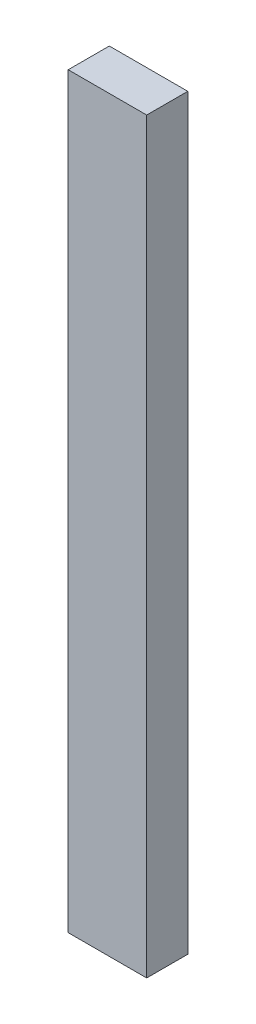
ISO-10303-21;
HEADER;
FILE_DESCRIPTION(('STEP AP214'),'2;1');
FILE_NAME('part.step','',(''),(''),'','','');
FILE_SCHEMA(('AUTOMOTIVE_DESIGN { 1 0 10303 214 1 1 1 1 }'));
ENDSEC;
DATA;
#1=APPLICATION_CONTEXT('core data for automotive mechanical design processes');
#2=APPLICATION_PROTOCOL_DEFINITION('international standard','automotive_design',2000,#1);
#3=PRODUCT_CONTEXT('',#1,'mechanical');
#4=PRODUCT('Part','Part','',(#3));
#5=PRODUCT_RELATED_PRODUCT_CATEGORY('part','',(#4));
#6=PRODUCT_DEFINITION_FORMATION('','',#4);
#7=PRODUCT_DEFINITION_CONTEXT('part definition',#1,'design');
#8=PRODUCT_DEFINITION('design','',#6,#7);
#9=PRODUCT_DEFINITION_SHAPE('','',#8);
#10=(LENGTH_UNIT() NAMED_UNIT(*) SI_UNIT(.MILLI.,.METRE.));
#11=(NAMED_UNIT(*) PLANE_ANGLE_UNIT() SI_UNIT($,.RADIAN.));
#12=(NAMED_UNIT(*) SI_UNIT($,.STERADIAN.) SOLID_ANGLE_UNIT());
#13=UNCERTAINTY_MEASURE_WITH_UNIT(LENGTH_MEASURE(1.E-05),#10,'distance_accuracy_value','');
#14=(GEOMETRIC_REPRESENTATION_CONTEXT(3) GLOBAL_UNCERTAINTY_ASSIGNED_CONTEXT((#13)) GLOBAL_UNIT_ASSIGNED_CONTEXT((#10,
#11,#12)) REPRESENTATION_CONTEXT('',''));
#15=CARTESIAN_POINT('',(0.,0.,0.));
#16=DIRECTION('',(0.,0.,1.));
#17=DIRECTION('',(1.,0.,0.));
#18=AXIS2_PLACEMENT_3D('',#15,#16,#17);
#19=CARTESIAN_POINT('',(0.,600.,0.));
#20=DIRECTION('',(0.,1.,0.));
#21=DIRECTION('',(0.,0.,1.));
#22=AXIS2_PLACEMENT_3D('',#19,#20,#21);
#23=PLANE('',#22);
#24=DIRECTION('',(0.,0.,-1.));
#25=VECTOR('',#24,1.);
#26=CARTESIAN_POINT('',(63.,600.,-30.));
#27=LINE('',#26,#25);
#28=CARTESIAN_POINT('',(63.,600.,33.));
#29=VERTEX_POINT('',#28);
#30=CARTESIAN_POINT('',(63.,600.,-33.));
#31=VERTEX_POINT('',#30);
#32=EDGE_CURVE('E163',#29,#31,#27,.T.);
#33=ORIENTED_EDGE('',*,*,#32,.T.);
#34=DIRECTION('',(-1.,0.,0.));
#35=VECTOR('',#34,1.);
#36=CARTESIAN_POINT('',(-60.,600.,-33.));
#37=LINE('',#36,#35);
#38=CARTESIAN_POINT('',(-63.,600.,-33.));
#39=VERTEX_POINT('',#38);
#40=EDGE_CURVE('E166',#31,#39,#37,.T.);
#41=ORIENTED_EDGE('',*,*,#40,.T.);
#42=DIRECTION('',(0.,0.,1.));
#43=VECTOR('',#42,1.);
#44=CARTESIAN_POINT('',(-63.,600.,-30.));
#45=LINE('',#44,#43);
#46=CARTESIAN_POINT('',(-63.,600.,33.));
#47=VERTEX_POINT('',#46);
#48=EDGE_CURVE('E169',#39,#47,#45,.T.);
#49=ORIENTED_EDGE('',*,*,#48,.T.);
#50=DIRECTION('',(1.,0.,0.));
#51=VECTOR('',#50,1.);
#52=CARTESIAN_POINT('',(-60.,600.,33.));
#53=LINE('',#52,#51);
#54=EDGE_CURVE('E171',#47,#29,#53,.T.);
#55=ORIENTED_EDGE('',*,*,#54,.T.);
#56=EDGE_LOOP('',(#33,#41,#49,#55));
#57=FACE_BOUND('',#56,.T.);
#58=ADVANCED_FACE('F61',(#57),#23,.T.);
#59=CARTESIAN_POINT('',(0.,-600.,0.));
#60=DIRECTION('',(0.,1.,0.));
#61=DIRECTION('',(0.,0.,1.));
#62=AXIS2_PLACEMENT_3D('',#59,#60,#61);
#63=PLANE('',#62);
#64=DIRECTION('',(0.,0.,-1.));
#65=VECTOR('',#64,1.);
#66=CARTESIAN_POINT('',(63.,-600.,-30.));
#67=LINE('',#66,#65);
#68=CARTESIAN_POINT('',(63.,-600.,33.));
#69=VERTEX_POINT('',#68);
#70=CARTESIAN_POINT('',(63.,-600.,-33.));
#71=VERTEX_POINT('',#70);
#72=EDGE_CURVE('E162',#69,#71,#67,.T.);
#73=ORIENTED_EDGE('',*,*,#72,.F.);
#74=DIRECTION('',(1.,0.,0.));
#75=VECTOR('',#74,1.);
#76=CARTESIAN_POINT('',(-60.,-600.,33.));
#77=LINE('',#76,#75);
#78=CARTESIAN_POINT('',(-63.,-600.,33.));
#79=VERTEX_POINT('',#78);
#80=EDGE_CURVE('E167',#79,#69,#77,.T.);
#81=ORIENTED_EDGE('',*,*,#80,.F.);
#82=DIRECTION('',(0.,0.,1.));
#83=VECTOR('',#82,1.);
#84=CARTESIAN_POINT('',(-63.,-600.,-30.));
#85=LINE('',#84,#83);
#86=CARTESIAN_POINT('',(-63.,-600.,-33.));
#87=VERTEX_POINT('',#86);
#88=EDGE_CURVE('E178',#87,#79,#85,.T.);
#89=ORIENTED_EDGE('',*,*,#88,.F.);
#90=DIRECTION('',(-1.,0.,0.));
#91=VECTOR('',#90,1.);
#92=CARTESIAN_POINT('',(-60.,-600.,-33.));
#93=LINE('',#92,#91);
#94=EDGE_CURVE('E176',#71,#87,#93,.T.);
#95=ORIENTED_EDGE('',*,*,#94,.F.);
#96=EDGE_LOOP('',(#73,#81,#89,#95));
#97=FACE_BOUND('',#96,.T.);
#98=DIRECTION('',(0.,0.,-1.));
#99=VECTOR('',#98,1.);
#100=CARTESIAN_POINT('',(60.,-600.,-30.));
#101=LINE('',#100,#99);
#102=CARTESIAN_POINT('',(60.,-600.,30.));
#103=VERTEX_POINT('',#102);
#104=CARTESIAN_POINT('',(60.,-600.,-30.));
#105=VERTEX_POINT('',#104);
#106=EDGE_CURVE('E143',#103,#105,#101,.T.);
#107=ORIENTED_EDGE('',*,*,#106,.T.);
#108=DIRECTION('',(-1.,0.,0.));
#109=VECTOR('',#108,1.);
#110=CARTESIAN_POINT('',(-60.,-600.,-30.));
#111=LINE('',#110,#109);
#112=CARTESIAN_POINT('',(-60.,-600.,-30.));
#113=VERTEX_POINT('',#112);
#114=EDGE_CURVE('E152',#105,#113,#111,.T.);
#115=ORIENTED_EDGE('',*,*,#114,.T.);
#116=DIRECTION('',(0.,0.,1.));
#117=VECTOR('',#116,1.);
#118=CARTESIAN_POINT('',(-60.,-600.,-30.));
#119=LINE('',#118,#117);
#120=CARTESIAN_POINT('',(-60.,-600.,30.));
#121=VERTEX_POINT('',#120);
#122=EDGE_CURVE('E155',#113,#121,#119,.T.);
#123=ORIENTED_EDGE('',*,*,#122,.T.);
#124=DIRECTION('',(1.,0.,0.));
#125=VECTOR('',#124,1.);
#126=CARTESIAN_POINT('',(-60.,-600.,30.));
#127=LINE('',#126,#125);
#128=EDGE_CURVE('E132',#121,#103,#127,.T.);
#129=ORIENTED_EDGE('',*,*,#128,.T.);
#130=EDGE_LOOP('',(#107,#115,#123,#129));
#131=FACE_BOUND('',#130,.T.);
#132=ADVANCED_FACE('F196',(#97,#131),#63,.F.);
#133=CARTESIAN_POINT('',(63.,600.,-30.));
#134=DIRECTION('',(-1.,0.,0.));
#135=DIRECTION('',(0.,0.,1.));
#136=AXIS2_PLACEMENT_3D('',#133,#134,#135);
#137=PLANE('',#136);
#138=ORIENTED_EDGE('',*,*,#72,.T.);
#139=DIRECTION('',(0.,-1.,0.));
#140=VECTOR('',#139,1.);
#141=CARTESIAN_POINT('',(63.,600.,-33.));
#142=LINE('',#141,#140);
#143=EDGE_CURVE('E12',#31,#71,#142,.T.);
#144=ORIENTED_EDGE('',*,*,#143,.F.);
#145=ORIENTED_EDGE('',*,*,#32,.F.);
#146=DIRECTION('',(0.,-1.,0.));
#147=VECTOR('',#146,1.);
#148=CARTESIAN_POINT('',(63.,600.,33.));
#149=LINE('',#148,#147);
#150=EDGE_CURVE('E173',#29,#69,#149,.T.);
#151=ORIENTED_EDGE('',*,*,#150,.T.);
#152=EDGE_LOOP('',(#138,#144,#145,#151));
#153=FACE_BOUND('',#152,.T.);
#154=ADVANCED_FACE('F63',(#153),#137,.F.);
#155=CARTESIAN_POINT('',(-60.,600.,-33.));
#156=DIRECTION('',(0.,0.,1.));
#157=DIRECTION('',(1.,0.,0.));
#158=AXIS2_PLACEMENT_3D('',#155,#156,#157);
#159=PLANE('',#158);
#160=ORIENTED_EDGE('',*,*,#94,.T.);
#161=DIRECTION('',(0.,-1.,0.));
#162=VECTOR('',#161,1.);
#163=CARTESIAN_POINT('',(-63.,600.,-33.));
#164=LINE('',#163,#162);
#165=EDGE_CURVE('E69',#39,#87,#164,.T.);
#166=ORIENTED_EDGE('',*,*,#165,.F.);
#167=ORIENTED_EDGE('',*,*,#40,.F.);
#168=ORIENTED_EDGE('',*,*,#143,.T.);
#169=EDGE_LOOP('',(#160,#166,#167,#168));
#170=FACE_BOUND('',#169,.T.);
#171=ADVANCED_FACE('F206',(#170),#159,.F.);
#172=CARTESIAN_POINT('',(-63.,600.,-30.));
#173=DIRECTION('',(1.,0.,0.));
#174=DIRECTION('',(0.,0.,-1.));
#175=AXIS2_PLACEMENT_3D('',#172,#173,#174);
#176=PLANE('',#175);
#177=ORIENTED_EDGE('',*,*,#88,.T.);
#178=DIRECTION('',(0.,-1.,0.));
#179=VECTOR('',#178,1.);
#180=CARTESIAN_POINT('',(-63.,600.,33.));
#181=LINE('',#180,#179);
#182=EDGE_CURVE('E183',#47,#79,#181,.T.);
#183=ORIENTED_EDGE('',*,*,#182,.F.);
#184=ORIENTED_EDGE('',*,*,#48,.F.);
#185=ORIENTED_EDGE('',*,*,#165,.T.);
#186=EDGE_LOOP('',(#177,#183,#184,#185));
#187=FACE_BOUND('',#186,.T.);
#188=ADVANCED_FACE('F190',(#187),#176,.F.);
#189=CARTESIAN_POINT('',(-60.,600.,33.));
#190=DIRECTION('',(0.,0.,-1.));
#191=DIRECTION('',(-1.,0.,0.));
#192=AXIS2_PLACEMENT_3D('',#189,#190,#191);
#193=PLANE('',#192);
#194=ORIENTED_EDGE('',*,*,#80,.T.);
#195=ORIENTED_EDGE('',*,*,#150,.F.);
#196=ORIENTED_EDGE('',*,*,#54,.F.);
#197=ORIENTED_EDGE('',*,*,#182,.T.);
#198=EDGE_LOOP('',(#194,#195,#196,#197));
#199=FACE_BOUND('',#198,.T.);
#200=ADVANCED_FACE('F200',(#199),#193,.F.);
#201=CARTESIAN_POINT('',(60.,600.,-30.));
#202=DIRECTION('',(-1.,0.,0.));
#203=DIRECTION('',(0.,0.,1.));
#204=AXIS2_PLACEMENT_3D('',#201,#202,#203);
#205=PLANE('',#204);
#206=DIRECTION('',(0.,0.,-1.));
#207=VECTOR('',#206,1.);
#208=CARTESIAN_POINT('',(60.,597.,-30.));
#209=LINE('',#208,#207);
#210=CARTESIAN_POINT('',(60.,597.,30.));
#211=VERTEX_POINT('',#210);
#212=CARTESIAN_POINT('',(60.,597.,-30.));
#213=VERTEX_POINT('',#212);
#214=EDGE_CURVE('E76',#211,#213,#209,.T.);
#215=ORIENTED_EDGE('',*,*,#214,.T.);
#216=DIRECTION('',(0.,-1.,0.));
#217=VECTOR('',#216,1.);
#218=CARTESIAN_POINT('',(60.,600.,-30.));
#219=LINE('',#218,#217);
#220=EDGE_CURVE('E160',#213,#105,#219,.T.);
#221=ORIENTED_EDGE('',*,*,#220,.T.);
#222=ORIENTED_EDGE('',*,*,#106,.F.);
#223=DIRECTION('',(0.,-1.,0.));
#224=VECTOR('',#223,1.);
#225=CARTESIAN_POINT('',(60.,600.,30.));
#226=LINE('',#225,#224);
#227=EDGE_CURVE('E137',#211,#103,#226,.T.);
#228=ORIENTED_EDGE('',*,*,#227,.F.);
#229=EDGE_LOOP('',(#215,#221,#222,#228));
#230=FACE_BOUND('',#229,.T.);
#231=ADVANCED_FACE('F220',(#230),#205,.T.);
#232=CARTESIAN_POINT('',(-60.,600.,-30.));
#233=DIRECTION('',(0.,0.,1.));
#234=DIRECTION('',(1.,0.,0.));
#235=AXIS2_PLACEMENT_3D('',#232,#233,#234);
#236=PLANE('',#235);
#237=DIRECTION('',(-1.,0.,0.));
#238=VECTOR('',#237,1.);
#239=CARTESIAN_POINT('',(-60.,597.,-30.));
#240=LINE('',#239,#238);
#241=CARTESIAN_POINT('',(-60.,597.,-30.));
#242=VERTEX_POINT('',#241);
#243=EDGE_CURVE('E83',#213,#242,#240,.T.);
#244=ORIENTED_EDGE('',*,*,#243,.T.);
#245=DIRECTION('',(0.,-1.,0.));
#246=VECTOR('',#245,1.);
#247=CARTESIAN_POINT('',(-60.,600.,-30.));
#248=LINE('',#247,#246);
#249=EDGE_CURVE('E136',#242,#113,#248,.T.);
#250=ORIENTED_EDGE('',*,*,#249,.T.);
#251=ORIENTED_EDGE('',*,*,#114,.F.);
#252=ORIENTED_EDGE('',*,*,#220,.F.);
#253=EDGE_LOOP('',(#244,#250,#251,#252));
#254=FACE_BOUND('',#253,.T.);
#255=ADVANCED_FACE('F227',(#254),#236,.T.);
#256=CARTESIAN_POINT('',(-60.,600.,-30.));
#257=DIRECTION('',(1.,0.,0.));
#258=DIRECTION('',(0.,0.,-1.));
#259=AXIS2_PLACEMENT_3D('',#256,#257,#258);
#260=PLANE('',#259);
#261=DIRECTION('',(0.,0.,1.));
#262=VECTOR('',#261,1.);
#263=CARTESIAN_POINT('',(-60.,597.,30.));
#264=LINE('',#263,#262);
#265=CARTESIAN_POINT('',(-60.,597.,30.));
#266=VERTEX_POINT('',#265);
#267=EDGE_CURVE('E140',#242,#266,#264,.T.);
#268=ORIENTED_EDGE('',*,*,#267,.T.);
#269=DIRECTION('',(0.,-1.,0.));
#270=VECTOR('',#269,1.);
#271=CARTESIAN_POINT('',(-60.,600.,30.));
#272=LINE('',#271,#270);
#273=EDGE_CURVE('E126',#266,#121,#272,.T.);
#274=ORIENTED_EDGE('',*,*,#273,.T.);
#275=ORIENTED_EDGE('',*,*,#122,.F.);
#276=ORIENTED_EDGE('',*,*,#249,.F.);
#277=EDGE_LOOP('',(#268,#274,#275,#276));
#278=FACE_BOUND('',#277,.T.);
#279=ADVANCED_FACE('F141',(#278),#260,.T.);
#280=CARTESIAN_POINT('',(-60.,600.,30.));
#281=DIRECTION('',(0.,0.,-1.));
#282=DIRECTION('',(-1.,0.,0.));
#283=AXIS2_PLACEMENT_3D('',#280,#281,#282);
#284=PLANE('',#283);
#285=DIRECTION('',(1.,0.,0.));
#286=VECTOR('',#285,1.);
#287=CARTESIAN_POINT('',(60.,597.,30.));
#288=LINE('',#287,#286);
#289=EDGE_CURVE('E130',#266,#211,#288,.T.);
#290=ORIENTED_EDGE('',*,*,#289,.T.);
#291=ORIENTED_EDGE('',*,*,#227,.T.);
#292=ORIENTED_EDGE('',*,*,#128,.F.);
#293=ORIENTED_EDGE('',*,*,#273,.F.);
#294=EDGE_LOOP('',(#290,#291,#292,#293));
#295=FACE_BOUND('',#294,.T.);
#296=ADVANCED_FACE('F128',(#295),#284,.T.);
#297=CARTESIAN_POINT('',(0.,597.,0.));
#298=DIRECTION('',(0.,-1.,0.));
#299=DIRECTION('',(0.,0.,-1.));
#300=AXIS2_PLACEMENT_3D('',#297,#298,#299);
#301=PLANE('',#300);
#302=ORIENTED_EDGE('',*,*,#289,.F.);
#303=ORIENTED_EDGE('',*,*,#267,.F.);
#304=ORIENTED_EDGE('',*,*,#243,.F.);
#305=ORIENTED_EDGE('',*,*,#214,.F.);
#306=EDGE_LOOP('',(#302,#303,#304,#305));
#307=FACE_BOUND('',#306,.T.);
#308=ADVANCED_FACE('F145',(#307),#301,.T.);
#309=CLOSED_SHELL('',(#58,#132,#154,#171,#188,#200,#231,#255,#279,#296,#308));
#310=MANIFOLD_SOLID_BREP('B2',#309);
#311=ADVANCED_BREP_SHAPE_REPRESENTATION('',(#18,#310),#14);
#312=SHAPE_DEFINITION_REPRESENTATION(#9,#311);
ENDSEC;
END-ISO-10303-21;
